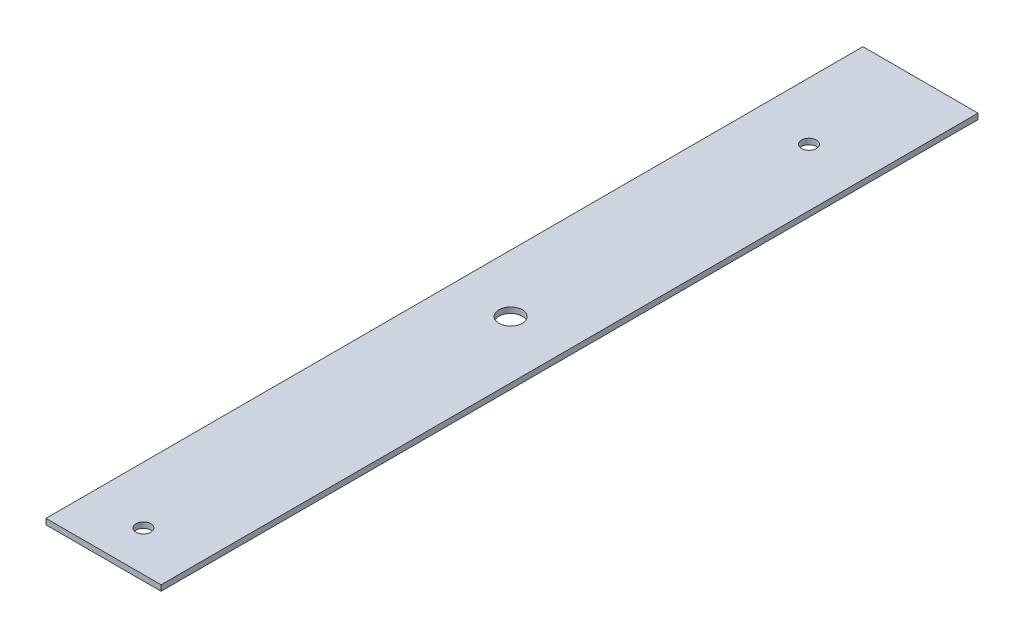
ISO-10303-21;
HEADER;
FILE_DESCRIPTION(('STEP AP214'),'2;1');
FILE_NAME('part.step','',(''),(''),'','','');
FILE_SCHEMA(('AUTOMOTIVE_DESIGN { 1 0 10303 214 1 1 1 1 }'));
ENDSEC;
DATA;
#1=APPLICATION_CONTEXT('core data for automotive mechanical design processes');
#2=APPLICATION_PROTOCOL_DEFINITION('international standard','automotive_design',2000,#1);
#3=PRODUCT_CONTEXT('',#1,'mechanical');
#4=PRODUCT('Part','Part','',(#3));
#5=PRODUCT_RELATED_PRODUCT_CATEGORY('part','',(#4));
#6=PRODUCT_DEFINITION_FORMATION('','',#4);
#7=PRODUCT_DEFINITION_CONTEXT('part definition',#1,'design');
#8=PRODUCT_DEFINITION('design','',#6,#7);
#9=PRODUCT_DEFINITION_SHAPE('','',#8);
#10=(LENGTH_UNIT() NAMED_UNIT(*) SI_UNIT(.MILLI.,.METRE.));
#11=(NAMED_UNIT(*) PLANE_ANGLE_UNIT() SI_UNIT($,.RADIAN.));
#12=(NAMED_UNIT(*) SI_UNIT($,.STERADIAN.) SOLID_ANGLE_UNIT());
#13=UNCERTAINTY_MEASURE_WITH_UNIT(LENGTH_MEASURE(1.E-05),#10,'distance_accuracy_value','');
#14=(GEOMETRIC_REPRESENTATION_CONTEXT(3) GLOBAL_UNCERTAINTY_ASSIGNED_CONTEXT((#13)) GLOBAL_UNIT_ASSIGNED_CONTEXT((#10,
#11,#12)) REPRESENTATION_CONTEXT('',''));
#15=CARTESIAN_POINT('',(0.,0.,0.));
#16=DIRECTION('',(0.,0.,1.));
#17=DIRECTION('',(1.,0.,0.));
#18=AXIS2_PLACEMENT_3D('',#15,#16,#17);
#19=CARTESIAN_POINT('',(32.2012806053458,80.9157683632075,457.2));
#20=DIRECTION('',(-1.,0.,0.));
#21=DIRECTION('',(0.,0.,1.));
#22=AXIS2_PLACEMENT_3D('',#19,#20,#21);
#23=PLANE('',#22);
#24=DIRECTION('',(0.,1.,0.));
#25=VECTOR('',#24,1.);
#26=CARTESIAN_POINT('',(32.2012806053458,80.9157683632075,0.));
#27=LINE('',#26,#25);
#28=CARTESIAN_POINT('',(32.2012806053458,77.7407683632075,0.));
#29=VERTEX_POINT('',#28);
#30=CARTESIAN_POINT('',(32.2012806053458,80.9157683632075,0.));
#31=VERTEX_POINT('',#30);
#32=EDGE_CURVE('E95',#29,#31,#27,.T.);
#33=ORIENTED_EDGE('',*,*,#32,.T.);
#34=DIRECTION('',(0.,0.,-1.));
#35=VECTOR('',#34,1.);
#36=CARTESIAN_POINT('',(32.2012806053458,80.9157683632075,457.2));
#37=LINE('',#36,#35);
#38=CARTESIAN_POINT('',(32.2012806053458,80.9157683632075,457.2));
#39=VERTEX_POINT('',#38);
#40=EDGE_CURVE('E11',#39,#31,#37,.T.);
#41=ORIENTED_EDGE('',*,*,#40,.F.);
#42=DIRECTION('',(0.,1.,0.));
#43=VECTOR('',#42,1.);
#44=CARTESIAN_POINT('',(32.2012806053458,80.9157683632075,457.2));
#45=LINE('',#44,#43);
#46=CARTESIAN_POINT('',(32.2012806053458,77.7407683632075,457.2));
#47=VERTEX_POINT('',#46);
#48=EDGE_CURVE('E83',#47,#39,#45,.T.);
#49=ORIENTED_EDGE('',*,*,#48,.F.);
#50=DIRECTION('',(0.,0.,-1.));
#51=VECTOR('',#50,1.);
#52=CARTESIAN_POINT('',(32.2012806053458,77.7407683632075,457.2));
#53=LINE('',#52,#51);
#54=EDGE_CURVE('E91',#47,#29,#53,.T.);
#55=ORIENTED_EDGE('',*,*,#54,.T.);
#56=EDGE_LOOP('',(#33,#41,#49,#55));
#57=FACE_BOUND('',#56,.T.);
#58=ADVANCED_FACE('F32',(#57),#23,.F.);
#59=CARTESIAN_POINT('',(-32.2012806053458,80.9157683632075,457.2));
#60=DIRECTION('',(0.,-1.,0.));
#61=DIRECTION('',(0.,0.,-1.));
#62=AXIS2_PLACEMENT_3D('',#59,#60,#61);
#63=PLANE('',#62);
#64=CARTESIAN_POINT('',(-0.284263414064131,80.9157683632075,434.581619600131));
#65=DIRECTION('',(0.,1.,0.));
#66=DIRECTION('',(0.,0.,1.));
#67=AXIS2_PLACEMENT_3D('',#64,#65,#66);
#68=CIRCLE('',#67,4.15220737143447);
#69=CARTESIAN_POINT('',(-0.284263414064131,80.9157683632075,438.733826971565));
#70=VERTEX_POINT('',#69);
#71=EDGE_CURVE('E121',#70,#70,#68,.T.);
#72=ORIENTED_EDGE('',*,*,#71,.F.);
#73=EDGE_LOOP('',(#72));
#74=FACE_BOUND('',#73,.T.);
#75=CARTESIAN_POINT('',(0.,80.9157683632075,229.374972197508));
#76=DIRECTION('',(0.,1.,0.));
#77=DIRECTION('',(0.,0.,1.));
#78=AXIS2_PLACEMENT_3D('',#75,#76,#77);
#79=CIRCLE('',#78,6.56297171582347);
#80=CARTESIAN_POINT('',(0.,80.9157683632075,235.937943913331));
#81=VERTEX_POINT('',#80);
#82=EDGE_CURVE('E115',#81,#81,#79,.T.);
#83=ORIENTED_EDGE('',*,*,#82,.F.);
#84=EDGE_LOOP('',(#83));
#85=FACE_BOUND('',#84,.T.);
#86=CARTESIAN_POINT('',(0.,80.9157683632075,62.4034826765936));
#87=DIRECTION('',(0.,1.,0.));
#88=DIRECTION('',(0.,0.,1.));
#89=AXIS2_PLACEMENT_3D('',#86,#87,#88);
#90=CIRCLE('',#89,4.15220737143446);
#91=CARTESIAN_POINT('',(0.,80.9157683632075,66.555690048028));
#92=VERTEX_POINT('',#91);
#93=EDGE_CURVE('E109',#92,#92,#90,.T.);
#94=ORIENTED_EDGE('',*,*,#93,.F.);
#95=EDGE_LOOP('',(#94));
#96=FACE_BOUND('',#95,.T.);
#97=DIRECTION('',(-1.,0.,0.));
#98=VECTOR('',#97,1.);
#99=CARTESIAN_POINT('',(-32.2012806053458,80.9157683632075,0.));
#100=LINE('',#99,#98);
#101=CARTESIAN_POINT('',(-32.2012806053458,80.9157683632075,0.));
#102=VERTEX_POINT('',#101);
#103=EDGE_CURVE('E87',#31,#102,#100,.T.);
#104=ORIENTED_EDGE('',*,*,#103,.T.);
#105=DIRECTION('',(0.,0.,-1.));
#106=VECTOR('',#105,1.);
#107=CARTESIAN_POINT('',(-32.2012806053458,80.9157683632075,457.2));
#108=LINE('',#107,#106);
#109=CARTESIAN_POINT('',(-32.2012806053458,80.9157683632075,457.2));
#110=VERTEX_POINT('',#109);
#111=EDGE_CURVE('E40',#110,#102,#108,.T.);
#112=ORIENTED_EDGE('',*,*,#111,.F.);
#113=DIRECTION('',(-1.,0.,0.));
#114=VECTOR('',#113,1.);
#115=CARTESIAN_POINT('',(-32.2012806053458,80.9157683632075,457.2));
#116=LINE('',#115,#114);
#117=EDGE_CURVE('E78',#39,#110,#116,.T.);
#118=ORIENTED_EDGE('',*,*,#117,.F.);
#119=ORIENTED_EDGE('',*,*,#40,.T.);
#120=EDGE_LOOP('',(#104,#112,#118,#119));
#121=FACE_BOUND('',#120,.T.);
#122=ADVANCED_FACE('F86',(#74,#85,#96,#121),#63,.F.);
#123=CARTESIAN_POINT('',(-32.2012806053458,77.7407683632075,457.2));
#124=DIRECTION('',(1.,0.,0.));
#125=DIRECTION('',(0.,0.,-1.));
#126=AXIS2_PLACEMENT_3D('',#123,#124,#125);
#127=PLANE('',#126);
#128=DIRECTION('',(0.,-1.,0.));
#129=VECTOR('',#128,1.);
#130=CARTESIAN_POINT('',(-32.2012806053458,77.7407683632075,0.));
#131=LINE('',#130,#129);
#132=CARTESIAN_POINT('',(-32.2012806053458,77.7407683632075,0.));
#133=VERTEX_POINT('',#132);
#134=EDGE_CURVE('E65',#102,#133,#131,.T.);
#135=ORIENTED_EDGE('',*,*,#134,.T.);
#136=DIRECTION('',(0.,0.,-1.));
#137=VECTOR('',#136,1.);
#138=CARTESIAN_POINT('',(-32.2012806053458,77.7407683632075,457.2));
#139=LINE('',#138,#137);
#140=CARTESIAN_POINT('',(-32.2012806053458,77.7407683632075,457.2));
#141=VERTEX_POINT('',#140);
#142=EDGE_CURVE('E88',#141,#133,#139,.T.);
#143=ORIENTED_EDGE('',*,*,#142,.F.);
#144=DIRECTION('',(0.,-1.,0.));
#145=VECTOR('',#144,1.);
#146=CARTESIAN_POINT('',(-32.2012806053458,77.7407683632075,457.2));
#147=LINE('',#146,#145);
#148=EDGE_CURVE('E81',#110,#141,#147,.T.);
#149=ORIENTED_EDGE('',*,*,#148,.F.);
#150=ORIENTED_EDGE('',*,*,#111,.T.);
#151=EDGE_LOOP('',(#135,#143,#149,#150));
#152=FACE_BOUND('',#151,.T.);
#153=ADVANCED_FACE('F89',(#152),#127,.F.);
#154=CARTESIAN_POINT('',(32.2012806053458,77.7407683632075,457.2));
#155=DIRECTION('',(0.,1.,0.));
#156=DIRECTION('',(0.,0.,1.));
#157=AXIS2_PLACEMENT_3D('',#154,#155,#156);
#158=PLANE('',#157);
#159=CARTESIAN_POINT('',(-0.284263414064131,77.7407683632075,434.581619600131));
#160=DIRECTION('',(0.,1.,0.));
#161=DIRECTION('',(0.,0.,1.));
#162=AXIS2_PLACEMENT_3D('',#159,#160,#161);
#163=CIRCLE('',#162,4.15220737143447);
#164=CARTESIAN_POINT('',(-0.284263414064131,77.7407683632075,438.733826971565));
#165=VERTEX_POINT('',#164);
#166=EDGE_CURVE('E118',#165,#165,#163,.T.);
#167=ORIENTED_EDGE('',*,*,#166,.T.);
#168=EDGE_LOOP('',(#167));
#169=FACE_BOUND('',#168,.T.);
#170=CARTESIAN_POINT('',(0.,77.7407683632075,229.374972197508));
#171=DIRECTION('',(0.,1.,0.));
#172=DIRECTION('',(0.,0.,1.));
#173=AXIS2_PLACEMENT_3D('',#170,#171,#172);
#174=CIRCLE('',#173,6.56297171582347);
#175=CARTESIAN_POINT('',(0.,77.7407683632075,235.937943913331));
#176=VERTEX_POINT('',#175);
#177=EDGE_CURVE('E112',#176,#176,#174,.T.);
#178=ORIENTED_EDGE('',*,*,#177,.T.);
#179=EDGE_LOOP('',(#178));
#180=FACE_BOUND('',#179,.T.);
#181=CARTESIAN_POINT('',(0.,77.7407683632075,62.4034826765936));
#182=DIRECTION('',(0.,1.,0.));
#183=DIRECTION('',(0.,0.,1.));
#184=AXIS2_PLACEMENT_3D('',#181,#182,#183);
#185=CIRCLE('',#184,4.15220737143446);
#186=CARTESIAN_POINT('',(0.,77.7407683632075,66.555690048028));
#187=VERTEX_POINT('',#186);
#188=EDGE_CURVE('E98',#187,#187,#185,.T.);
#189=ORIENTED_EDGE('',*,*,#188,.T.);
#190=EDGE_LOOP('',(#189));
#191=FACE_BOUND('',#190,.T.);
#192=DIRECTION('',(1.,0.,0.));
#193=VECTOR('',#192,1.);
#194=CARTESIAN_POINT('',(32.2012806053458,77.7407683632075,0.));
#195=LINE('',#194,#193);
#196=EDGE_CURVE('E71',#133,#29,#195,.T.);
#197=ORIENTED_EDGE('',*,*,#196,.T.);
#198=ORIENTED_EDGE('',*,*,#54,.F.);
#199=DIRECTION('',(1.,0.,0.));
#200=VECTOR('',#199,1.);
#201=CARTESIAN_POINT('',(32.2012806053458,77.7407683632075,457.2));
#202=LINE('',#201,#200);
#203=EDGE_CURVE('E48',#141,#47,#202,.T.);
#204=ORIENTED_EDGE('',*,*,#203,.F.);
#205=ORIENTED_EDGE('',*,*,#142,.T.);
#206=EDGE_LOOP('',(#197,#198,#204,#205));
#207=FACE_BOUND('',#206,.T.);
#208=ADVANCED_FACE('F103',(#169,#180,#191,#207),#158,.F.);
#209=CARTESIAN_POINT('',(0.,0.,457.2));
#210=DIRECTION('',(0.,0.,-1.));
#211=DIRECTION('',(-1.,0.,0.));
#212=AXIS2_PLACEMENT_3D('',#209,#210,#211);
#213=PLANE('',#212);
#214=ORIENTED_EDGE('',*,*,#48,.T.);
#215=ORIENTED_EDGE('',*,*,#117,.T.);
#216=ORIENTED_EDGE('',*,*,#148,.T.);
#217=ORIENTED_EDGE('',*,*,#203,.T.);
#218=EDGE_LOOP('',(#214,#215,#216,#217));
#219=FACE_BOUND('',#218,.T.);
#220=ADVANCED_FACE('F79',(#219),#213,.F.);
#221=CARTESIAN_POINT('',(0.,0.,0.));
#222=DIRECTION('',(0.,0.,-1.));
#223=DIRECTION('',(-1.,0.,0.));
#224=AXIS2_PLACEMENT_3D('',#221,#222,#223);
#225=PLANE('',#224);
#226=ORIENTED_EDGE('',*,*,#32,.F.);
#227=ORIENTED_EDGE('',*,*,#196,.F.);
#228=ORIENTED_EDGE('',*,*,#134,.F.);
#229=ORIENTED_EDGE('',*,*,#103,.F.);
#230=EDGE_LOOP('',(#226,#227,#228,#229));
#231=FACE_BOUND('',#230,.T.);
#232=ADVANCED_FACE('F106',(#231),#225,.T.);
#233=CARTESIAN_POINT('',(0.,77.7407683632075,62.4034826765936));
#234=DIRECTION('',(0.,1.,0.));
#235=DIRECTION('',(0.,0.,1.));
#236=AXIS2_PLACEMENT_3D('',#233,#234,#235);
#237=CYLINDRICAL_SURFACE('',#236,4.15220737143446);
#238=ORIENTED_EDGE('',*,*,#188,.F.);
#239=EDGE_LOOP('',(#238));
#240=FACE_BOUND('',#239,.T.);
#241=ORIENTED_EDGE('',*,*,#93,.T.);
#242=EDGE_LOOP('',(#241));
#243=FACE_BOUND('',#242,.T.);
#244=ADVANCED_FACE('F142',(#240,#243),#237,.F.);
#245=CARTESIAN_POINT('',(0.,77.7407683632075,229.374972197508));
#246=DIRECTION('',(0.,1.,0.));
#247=DIRECTION('',(0.,0.,1.));
#248=AXIS2_PLACEMENT_3D('',#245,#246,#247);
#249=CYLINDRICAL_SURFACE('',#248,6.56297171582347);
#250=ORIENTED_EDGE('',*,*,#177,.F.);
#251=EDGE_LOOP('',(#250));
#252=FACE_BOUND('',#251,.T.);
#253=ORIENTED_EDGE('',*,*,#82,.T.);
#254=EDGE_LOOP('',(#253));
#255=FACE_BOUND('',#254,.T.);
#256=ADVANCED_FACE('F132',(#252,#255),#249,.F.);
#257=CARTESIAN_POINT('',(-0.284263414064131,77.7407683632075,434.581619600131));
#258=DIRECTION('',(0.,1.,0.));
#259=DIRECTION('',(0.,0.,1.));
#260=AXIS2_PLACEMENT_3D('',#257,#258,#259);
#261=CYLINDRICAL_SURFACE('',#260,4.15220737143447);
#262=ORIENTED_EDGE('',*,*,#166,.F.);
#263=EDGE_LOOP('',(#262));
#264=FACE_BOUND('',#263,.T.);
#265=ORIENTED_EDGE('',*,*,#71,.T.);
#266=EDGE_LOOP('',(#265));
#267=FACE_BOUND('',#266,.T.);
#268=ADVANCED_FACE('F129',(#264,#267),#261,.F.);
#269=CLOSED_SHELL('',(#58,#122,#153,#208,#220,#232,#244,#256,#268));
#270=MANIFOLD_SOLID_BREP('B2',#269);
#271=ADVANCED_BREP_SHAPE_REPRESENTATION('',(#18,#270),#14);
#272=SHAPE_DEFINITION_REPRESENTATION(#9,#271);
ENDSEC;
END-ISO-10303-21;
